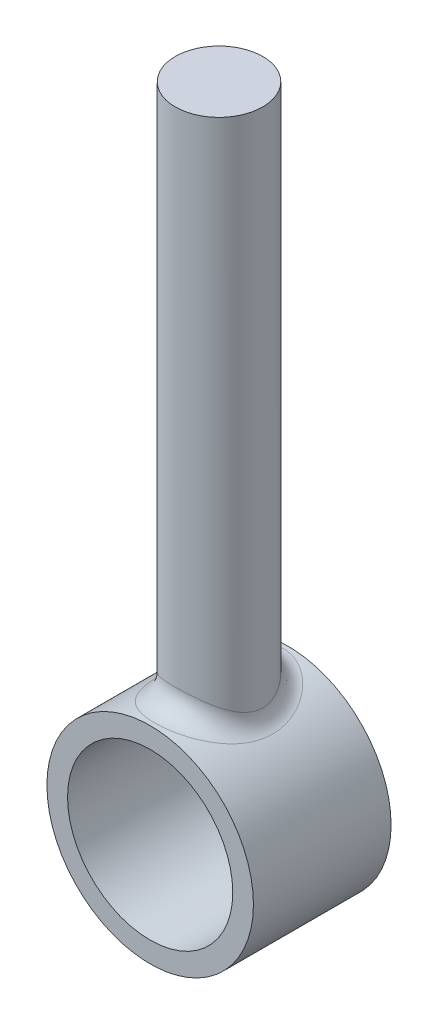
ISO-10303-21;
HEADER;
FILE_DESCRIPTION(('STEP AP214'),'2;1');
FILE_NAME('part.step','',(''),(''),'','','');
FILE_SCHEMA(('AUTOMOTIVE_DESIGN { 1 0 10303 214 1 1 1 1 }'));
ENDSEC;
DATA;
#1=APPLICATION_CONTEXT('core data for automotive mechanical design processes');
#2=APPLICATION_PROTOCOL_DEFINITION('international standard','automotive_design',2000,#1);
#3=PRODUCT_CONTEXT('',#1,'mechanical');
#4=PRODUCT('Part','Part','',(#3));
#5=PRODUCT_RELATED_PRODUCT_CATEGORY('part','',(#4));
#6=PRODUCT_DEFINITION_FORMATION('','',#4);
#7=PRODUCT_DEFINITION_CONTEXT('part definition',#1,'design');
#8=PRODUCT_DEFINITION('design','',#6,#7);
#9=PRODUCT_DEFINITION_SHAPE('','',#8);
#10=(LENGTH_UNIT() NAMED_UNIT(*) SI_UNIT(.MILLI.,.METRE.));
#11=(NAMED_UNIT(*) PLANE_ANGLE_UNIT() SI_UNIT($,.RADIAN.));
#12=(NAMED_UNIT(*) SI_UNIT($,.STERADIAN.) SOLID_ANGLE_UNIT());
#13=UNCERTAINTY_MEASURE_WITH_UNIT(LENGTH_MEASURE(1.E-05),#10,'distance_accuracy_value','');
#14=(GEOMETRIC_REPRESENTATION_CONTEXT(3) GLOBAL_UNCERTAINTY_ASSIGNED_CONTEXT((#13)) GLOBAL_UNIT_ASSIGNED_CONTEXT((#10,
#11,#12)) REPRESENTATION_CONTEXT('',''));
#15=CARTESIAN_POINT('',(0.,0.,0.));
#16=DIRECTION('',(0.,0.,1.));
#17=DIRECTION('',(1.,0.,0.));
#18=AXIS2_PLACEMENT_3D('',#15,#16,#17);
#19=CARTESIAN_POINT('',(0.,-25.978,5.));
#20=DIRECTION('',(0.,0.,-1.));
#21=DIRECTION('',(-1.,0.,0.));
#22=AXIS2_PLACEMENT_3D('',#19,#20,#21);
#23=CYLINDRICAL_SURFACE('',#22,7.5);
#24=CARTESIAN_POINT('',(1.6450289882719,-18.6606316460257,4.23778381515067));
#25=CARTESIAN_POINT('',(1.09322575082646,-18.5365798998911,2.99332384385615));
#26=CARTESIAN_POINT('',(1.34065464070929,-17.1971579752308,2.87806708301677));
#27=CARTESIAN_POINT('',(1.44203939494273,-18.6150002971392,4.35124573353092));
#28=CARTESIAN_POINT('',(0.938295106905664,-18.5179839059775,3.04802916675819));
#29=CARTESIAN_POINT('',(1.17522354966681,-17.1424003564214,2.95512410774215));
#30=CARTESIAN_POINT('',(1.2295609307881,-18.5761689475341,4.44440059404207));
#31=CARTESIAN_POINT('',(0.7877459844616,-18.5051216793896,3.08719460432516));
#32=CARTESIAN_POINT('',(1.002059282641,-17.0958027362642,3.01838970802773));
#33=CARTESIAN_POINT('',(0.792033593211486,-18.5166834757347,4.58540806294734));
#34=CARTESIAN_POINT('',(0.493287508632277,-18.4871656332978,3.14364936201235));
#35=CARTESIAN_POINT('',(0.645486201114157,-17.0244201700815,3.11415413878345));
#36=CARTESIAN_POINT('',(0.566997220877099,-18.4960116077848,4.63330490172375));
#37=CARTESIAN_POINT('',(0.350721627151847,-18.482255314329,3.16039689733207));
#38=CARTESIAN_POINT('',(0.462087574665286,-16.9996139291482,3.14668300806905));
#39=CARTESIAN_POINT('',(0.136977248105188,-18.4764976034986,4.67850004340064));
#40=CARTESIAN_POINT('',(0.0832743171793821,-18.4776035738306,3.1763042660486));
#41=CARTESIAN_POINT('',(0.111632794708939,-16.9761971243712,3.17737703487064));
#42=CARTESIAN_POINT('',(-0.0675626882025528,-18.4755484212161,4.68068241716148));
#43=CARTESIAN_POINT('',(-0.0407890760889766,-18.4774024644325,3.17702748023667));
#44=CARTESIAN_POINT('',(-0.0550617843970073,-16.975058105476,3.17885918171123));
#45=CARTESIAN_POINT('',(-0.473792004223369,-18.4902235916526,4.64672271772461));
#46=CARTESIAN_POINT('',(-0.29244932779864,-18.4808642320687,3.16513524123819));
#47=CARTESIAN_POINT('',(-0.386127815205813,-16.9926683099145,3.15579564249924));
#48=CARTESIAN_POINT('',(-0.675481788317079,-18.5058455688332,4.6105861376942));
#49=CARTESIAN_POINT('',(-0.418970823167175,-18.4844975344669,3.15262163664978));
#50=CARTESIAN_POINT('',(-0.550499596468077,-17.0114146826019,3.13125368710038));
#51=CARTESIAN_POINT('',(-1.06205424216322,-18.5511267345274,4.50397278564577));
#52=CARTESIAN_POINT('',(-0.673728429773465,-18.4973689618262,3.11135220896023));
#53=CARTESIAN_POINT('',(-0.865545810190732,-17.0657520814308,3.05884782768144));
#54=CARTESIAN_POINT('',(-1.24728663322257,-18.5801960144874,4.43493578110697));
#55=CARTESIAN_POINT('',(-0.800736119162803,-18.5062714126281,3.08358695130249));
#56=CARTESIAN_POINT('',(-1.0165052561655,-17.1006352173136,3.01196173366267));
#57=CARTESIAN_POINT('',(-1.60537378751495,-18.6495577382389,4.26588332327446));
#58=CARTESIAN_POINT('',(-1.06009035276438,-18.5315554375819,3.00786961517194));
#59=CARTESIAN_POINT('',(-1.30833671238247,-17.1838692858844,2.89715070616059));
#60=CARTESIAN_POINT('',(-1.77822604949261,-18.6898524419958,4.16586163151495));
#61=CARTESIAN_POINT('',(-1.19176081862819,-18.5477607078329,2.96041043776462));
#62=CARTESIAN_POINT('',(-1.44920668416843,-17.2322229305311,2.82922153585827));
#63=CARTESIAN_POINT('',(-2.12016488755937,-18.7815798706479,3.92972006352564));
#64=CARTESIAN_POINT('',(-1.4653167019894,-18.5899034475254,2.83778700408043));
#65=CARTESIAN_POINT('',(-1.72787769447835,-17.3422958446315,2.6688473158526));
#66=CARTESIAN_POINT('',(-2.28809336781803,-18.8336039437003,3.7915265429772));
#67=CARTESIAN_POINT('',(-1.60704878304232,-18.6162379374504,2.76149912908783));
#68=CARTESIAN_POINT('',(-1.86473491586928,-17.4047247318332,2.57499396224574));
#69=CARTESIAN_POINT('',(-2.60326526228775,-18.9423181027993,3.48651849017231));
#70=CARTESIAN_POINT('',(-1.88422223748493,-18.6771100637053,2.58013710139505));
#71=CARTESIAN_POINT('',(-2.12159158279289,-17.5351817228008,2.36784945579483));
#72=CARTESIAN_POINT('',(-2.75049702919045,-18.9990107879288,3.31968795847309));
#73=CARTESIAN_POINT('',(-2.01971606674273,-18.7114590175672,2.47571588358676));
#74=CARTESIAN_POINT('',(-2.24158153608062,-17.6032129454666,2.25454743701916));
#75=CARTESIAN_POINT('',(-2.96089622763657,-19.0867233986825,3.04124292562409));
#76=CARTESIAN_POINT('',(-2.21983129726087,-18.7684663003568,2.29130982822844));
#77=CARTESIAN_POINT('',(-2.41305125718005,-17.7084680784454,2.06544305645023));
#78=CARTESIAN_POINT('',(-3.03218177524414,-19.117870103987,2.93836081882805));
#79=CARTESIAN_POINT('',(-2.28861167493303,-18.7893137465976,2.22189897392033));
#80=CARTESIAN_POINT('',(-2.47114707247484,-17.7458441246963,1.99557125129197));
#81=CARTESIAN_POINT('',(-3.16722734473644,-19.1791648335793,2.72551155037781));
#82=CARTESIAN_POINT('',(-2.42064584162973,-18.8314802238779,2.07518719612317));
#83=CARTESIAN_POINT('',(-2.58120560077174,-17.8193978001691,1.85101586576116));
#84=CARTESIAN_POINT('',(-3.23099429422513,-19.2093137584953,2.61555105747698));
#85=CARTESIAN_POINT('',(-2.48400536937995,-18.8528071315076,1.99793121365512));
#86=CARTESIAN_POINT('',(-2.63317395958591,-17.8555765101447,1.77633681443499));
#87=CARTESIAN_POINT('',(-3.41057464096305,-19.2970022400912,2.27538963276126));
#88=CARTESIAN_POINT('',(-2.66342847084105,-18.915923011015,1.75580643832311));
#89=CARTESIAN_POINT('',(-2.77952714052119,-17.9608026882087,1.54531809284035));
#90=CARTESIAN_POINT('',(-3.51471086003804,-19.3518023888657,2.03485155503515));
#91=CARTESIAN_POINT('',(-2.77132580212608,-18.9576118044428,1.57817371805187));
#92=CARTESIAN_POINT('',(-2.86439537467316,-18.0265628667302,1.38195800796617));
#93=CARTESIAN_POINT('',(-3.6440120613738,-19.4225766631676,1.6590432167723));
#94=CARTESIAN_POINT('',(-2.90681208166468,-19.0128083300432,1.29362737534344));
#95=CARTESIAN_POINT('',(-2.9697723965578,-18.1114919957557,1.12672988518705));
#96=CARTESIAN_POINT('',(-3.68255802481809,-19.4442190459931,1.53165051688715));
#97=CARTESIAN_POINT('',(-2.94744333162807,-19.0299092268233,1.1964642693053));
#98=CARTESIAN_POINT('',(-3.00118632614852,-18.1374628550801,1.04021184836616));
#99=CARTESIAN_POINT('',(-3.75045670989447,-19.4829555291165,1.27243943600549));
#100=CARTESIAN_POINT('',(-3.01926518005151,-19.0607594730718,0.997295769522146));
#101=CARTESIAN_POINT('',(-3.05652193899948,-18.1839466348634,0.864170098248855));
#102=CARTESIAN_POINT('',(-3.77981522378688,-19.5000524940622,1.14062390168309));
#103=CARTESIAN_POINT('',(-3.050569102651,-19.0745529570825,0.895176407171979));
#104=CARTESIAN_POINT('',(-3.08044834279707,-18.2044629928996,0.774648318255174));
#105=CARTESIAN_POINT('',(-3.82887557518924,-19.5289283477015,0.873766088750262));
#106=CARTESIAN_POINT('',(-3.10296336744375,-19.0979547639757,0.687427271384792));
#107=CARTESIAN_POINT('',(-3.12043121743801,-18.2391140172169,0.593413333001703));
#108=CARTESIAN_POINT('',(-3.84858825686076,-19.5407132072579,0.738727613506815));
#109=CARTESIAN_POINT('',(-3.12415057664282,-19.1076043284358,0.581649843491005));
#110=CARTESIAN_POINT('',(-3.13649652598299,-18.2532558485337,0.50170271077725));
#111=CARTESIAN_POINT('',(-3.8780705755923,-19.5584309062459,0.466548426019344));
#112=CARTESIAN_POINT('',(-3.15583235106425,-19.1221284484046,0.367934018098203));
#113=CARTESIAN_POINT('',(-3.16052382744814,-18.2745170873269,0.316853743873871));
#114=CARTESIAN_POINT('',(-3.88784145392864,-19.5643644762331,0.329407978386319));
#115=CARTESIAN_POINT('',(-3.16638298666518,-19.1270283661936,0.259817888244164));
#116=CARTESIAN_POINT('',(-3.16848683197533,-18.2816373714698,0.223715578904021));
#117=CARTESIAN_POINT('',(-3.89661361086944,-19.5696910413087,0.0732163025680286));
#118=CARTESIAN_POINT('',(-3.17583901086742,-19.1314195708611,0.0578100448446339));
#119=CARTESIAN_POINT('',(-3.17563590532583,-18.2880292495791,0.0497244407815444));
#120=CARTESIAN_POINT('',(-3.89690239622897,-19.5698659714204,-0.0457500390147805));
#121=CARTESIAN_POINT('',(-3.17614941173688,-19.1315634208127,-0.0361334145554285));
#122=CARTESIAN_POINT('',(-3.17587125771396,-18.288239165611,-0.03107088211163));
#123=CARTESIAN_POINT('',(-3.88993898912552,-19.5656386703365,-0.283257256010858));
#124=CARTESIAN_POINT('',(-3.16864618944987,-19.1280797757073,-0.223426369283723));
#125=CARTESIAN_POINT('',(-3.17019626712184,-18.283166404286,-0.192372574937864));
#126=CARTESIAN_POINT('',(-3.88268438258893,-19.5612349738662,-0.401797983030862));
#127=CARTESIAN_POINT('',(-3.16082002712633,-19.1244464593777,-0.316899308097917));
#128=CARTESIAN_POINT('',(-3.16428395673612,-18.2778819685994,-0.272878844090471));
#129=CARTESIAN_POINT('',(-3.84970763571254,-19.5413458315749,-0.755322183868787));
#130=CARTESIAN_POINT('',(-3.12529916671499,-19.1080909620706,-0.595067861358765));
#131=CARTESIAN_POINT('',(-3.13740878971334,-18.2540149979699,-0.512972820060635));
#132=CARTESIAN_POINT('',(-3.81278004710864,-19.5191866309638,-0.988434412664547));
#133=CARTESIAN_POINT('',(-3.0854366920115,-19.0898560741361,-0.777865177617774));
#134=CARTESIAN_POINT('',(-3.10731379239761,-18.2274239571661,-0.671289681328453));
#135=CARTESIAN_POINT('',(-3.71294260883699,-19.4613167861552,-1.43354989137257));
#136=CARTESIAN_POINT('',(-2.97933833937486,-19.0433702151406,-1.12216158329977));
#137=CARTESIAN_POINT('',(-3.02594894966695,-18.1579801433771,-0.973587359381253));
#138=CARTESIAN_POINT('',(-3.65111384807335,-19.4261745011992,-1.64602296691745));
#139=CARTESIAN_POINT('',(-2.91372793442097,-19.015346189868,-1.28490160498296));
#140=CARTESIAN_POINT('',(-2.97556016280449,-18.1158094014768,-1.11788725560658));
#141=CARTESIAN_POINT('',(-3.50374034858941,-19.3461969622425,-2.05615320588233));
#142=CARTESIAN_POINT('',(-2.76031128700814,-18.9535102884862,-1.59315911816067));
#143=CARTESIAN_POINT('',(-2.85545470121372,-18.0198363546532,-1.39642490453017));
#144=CARTESIAN_POINT('',(-3.41817817471035,-19.3013545876657,-2.2537993409276));
#145=CARTESIAN_POINT('',(-2.67193458817433,-18.9195110446618,-1.73898977904403));
#146=CARTESIAN_POINT('',(-2.78572381729725,-17.9660255050384,-1.53065516736964));
#147=CARTESIAN_POINT('',(-3.26780098367605,-19.2270655969954,-2.54833662858927));
#148=CARTESIAN_POINT('',(-2.52085144766769,-18.8655570921606,-1.95010586267325));
#149=CARTESIAN_POINT('',(-2.66317042731189,-17.8768787164846,-1.73068851246341));
#150=CARTESIAN_POINT('',(-3.21031719564777,-19.1994800952031,-2.65143603798126));
#151=CARTESIAN_POINT('',(-2.46343534658038,-18.8458419683228,-2.02310936202533));
#152=CARTESIAN_POINT('',(-2.61632267701609,-17.8437761145134,-1.80070789744967));
#153=CARTESIAN_POINT('',(-3.08895246827081,-19.1433203656377,-2.85148595549195));
#154=CARTESIAN_POINT('',(-2.34392861551065,-18.8066840826799,-2.16237111206372));
#155=CARTESIAN_POINT('',(-2.51741366950535,-17.7763844381579,-1.93657067565185));
#156=CARTESIAN_POINT('',(-3.02507765510105,-19.114747101571,-2.94844220928031));
#157=CARTESIAN_POINT('',(-2.28175813484449,-18.7872312061711,-2.22861394375301));
#158=CARTESIAN_POINT('',(-2.46535740496209,-17.7420965202226,-2.00241797100706));
#159=CARTESIAN_POINT('',(-2.82407228799192,-19.0284789919451,-3.22988207630327));
#160=CARTESIAN_POINT('',(-2.08833137158886,-18.7299255062654,-2.41800599815624));
#161=CARTESIAN_POINT('',(-2.30154340556737,-17.6385747875599,-2.19355627642136));
#162=CARTESIAN_POINT('',(-2.67764301867692,-18.9702780991101,-3.40477636011647));
#163=CARTESIAN_POINT('',(-1.95184856710735,-18.6937660741648,-2.52943750336742));
#164=CARTESIAN_POINT('',(-2.18220746571416,-17.5687337181603,-2.31233474724585));
#165=CARTESIAN_POINT('',(-2.34706369409818,-18.8523358556754,-3.7413037576232));
#166=CARTESIAN_POINT('',(-1.65694948428337,-18.6259005315703,-2.73350264330722));
#167=CARTESIAN_POINT('',(-1.91279415472828,-17.4272030276589,-2.54088543966816));
#168=CARTESIAN_POINT('',(-2.16061196506643,-18.7930152693822,-3.89989624864434));
#169=CARTESIAN_POINT('',(-1.49788805355711,-18.5953116437857,-2.82205656510199));
#170=CARTESIAN_POINT('',(-1.76084098109117,-17.3560183234685,-2.64859263945093));
#171=CARTESIAN_POINT('',(-1.76516469798172,-18.6858206913607,-4.17658944241452));
#172=CARTESIAN_POINT('',(-1.18020218675321,-18.5456165029172,-2.96664203498092));
#173=CARTESIAN_POINT('',(-1.43856203200248,-17.2273848294234,-2.83650726838048));
#174=CARTESIAN_POINT('',(-1.55621896896832,-18.6379221345907,-4.29477728428195));
#175=CARTESIAN_POINT('',(-1.02214758113554,-18.5268474437975,-3.02171178400065));
#176=CARTESIAN_POINT('',(-1.26827684958686,-17.1699065615165,-2.91677387757019));
#177=CARTESIAN_POINT('',(-1.22038847905626,-18.5769675516261,-4.44229861610481));
#178=CARTESIAN_POINT('',(-0.783748454546603,-18.5055890555733,-3.08589760285962));
#179=CARTESIAN_POINT('',(-0.9945839797171,-17.0967610619471,-3.01696216173432));
#180=CARTESIAN_POINT('',(-1.099306909846,-18.5579650179546,-4.48761297986368));
#181=CARTESIAN_POINT('',(-0.70043073848205,-18.4995962247819,-3.10448356232516));
#182=CARTESIAN_POINT('',(-0.89590573829302,-17.07395802147,-3.04773715743192));
#183=CARTESIAN_POINT('',(-0.853306029351656,-18.5256678971008,-4.5640286338107));
#184=CARTESIAN_POINT('',(-0.535806628935572,-18.490030739693,-3.13475856927773));
#185=CARTESIAN_POINT('',(-0.695421598257456,-17.0352014764337,-3.09963441973849));
#186=CARTESIAN_POINT('',(-0.728386594462704,-18.5123734939653,-4.59512946571512));
#187=CARTESIAN_POINT('',(-0.45473775927247,-18.4864904323915,-3.14635138124871));
#188=CARTESIAN_POINT('',(-0.593615598911304,-17.0192481927307,-3.12075637510664));
#189=CARTESIAN_POINT('',(-0.406997469902871,-18.4865015193142,-4.65544519032728));
#190=CARTESIAN_POINT('',(-0.249961386623884,-18.4798305655597,-3.16848575249402));
#191=CARTESIAN_POINT('',(-0.331692055683086,-16.9882018232199,-3.16171946081776));
#192=CARTESIAN_POINT('',(-0.208739266076666,-18.4782874011171,-4.67433802326917));
#193=CARTESIAN_POINT('',(-0.128401729770595,-18.4780648374435,-3.17477437739676));
#194=CARTESIAN_POINT('',(-0.170116920588319,-16.9783448813501,-3.17455042222058));
#195=CARTESIAN_POINT('',(0.187997777898833,-18.4777269348949,-4.67562885641427));
#196=CARTESIAN_POINT('',(0.115663844096953,-18.4779384511558,-3.17521419783692));
#197=CARTESIAN_POINT('',(0.153213162308631,-16.977672321864,-3.17542708430233));
#198=CARTESIAN_POINT('',(0.386476654957567,-18.4853949983396,-4.65799371117943));
#199=CARTESIAN_POINT('',(0.237171879947824,-18.4795818870031,-3.16935084390823));
#200=CARTESIAN_POINT('',(0.314968140191024,-16.9868739980115,-3.16345027444313));
#201=CARTESIAN_POINT('',(0.777351401638813,-18.5158230116388,-4.58711452669661));
#202=CARTESIAN_POINT('',(0.485396432604704,-18.4873403718809,-3.14349593814017));
#203=CARTESIAN_POINT('',(0.633520607537793,-17.0233876139626,-3.11531307427483));
#204=CARTESIAN_POINT('',(0.969758171158538,-18.5385540926135,-4.53393860111182));
#205=CARTESIAN_POINT('',(0.61113591962856,-18.4933839507536,-3.1237352121631));
#206=CARTESIAN_POINT('',(0.790326980126966,-17.0506649111105,-3.07919894297767));
#207=CARTESIAN_POINT('',(1.34386226141183,-18.5969479229879,-4.3943541318289));
#208=CARTESIAN_POINT('',(0.86912872030693,-18.512175410647,-3.06573151106708));
#209=CARTESIAN_POINT('',(1.09521181089972,-17.1207375075619,-2.98440093442744));
#210=CARTESIAN_POINT('',(1.52555840300832,-18.6326120931168,-4.30794193698799));
#211=CARTESIAN_POINT('',(1.00055485443775,-18.5247768533484,-3.02790994587345));
#212=CARTESIAN_POINT('',(1.24328930811812,-17.1635345117404,-2.92571457752125));
#213=CARTESIAN_POINT('',(1.88018388552163,-18.7151383218048,-4.1015696328978));
#214=CARTESIAN_POINT('',(1.27122841260904,-18.5588775393529,-2.927907127394));
#215=CARTESIAN_POINT('',(1.53229959440582,-17.2625659861655,-2.78555798598425));
#216=CARTESIAN_POINT('',(2.05262162503859,-18.7623329545759,-3.98059061831989));
#217=CARTESIAN_POINT('',(1.41009191712221,-18.5804398629805,-2.86556530694843));
#218=CARTESIAN_POINT('',(1.6728317414786,-17.3191995454648,-2.70339576751978));
#219=CARTESIAN_POINT('',(2.37890925178803,-18.8632262240842,-3.70986510006186));
#220=CARTESIAN_POINT('',(1.68522645235529,-18.6322625894902,-2.71394213965717));
#221=CARTESIAN_POINT('',(1.9387474330113,-17.4402714688689,-2.5195340519078));
#222=CARTESIAN_POINT('',(2.53274999875391,-18.9169280332902,-3.5601045433857));
#223=CARTESIAN_POINT('',(1.82134122758631,-18.6623073898989,-2.62532181293161));
#224=CARTESIAN_POINT('',(2.06412352839833,-17.5047136399362,-2.41782501074692));
#225=CARTESIAN_POINT('',(2.83486070963622,-19.0323227111417,-3.21742802207489));
#226=CARTESIAN_POINT('',(2.09752374818,-18.7321644661902,-2.41005703192704));
#227=CARTESIAN_POINT('',(2.3103356799365,-17.6431872533834,-2.18509817542168));
#228=CARTESIAN_POINT('',(2.98075812167023,-19.0942544065299,-3.02160469448358));
#229=CARTESIAN_POINT('',(2.23711779162649,-18.7726156750326,-2.28075781997533));
#230=CARTESIAN_POINT('',(2.42923816974049,-17.7175052878528,-2.05210586202949));
#231=CARTESIAN_POINT('',(3.24388575203309,-19.2142619908608,-2.60227160095058));
#232=CARTESIAN_POINT('',(2.49483197361197,-18.8554453921601,-1.99098423215386));
#233=CARTESIAN_POINT('',(2.64368015299956,-17.8615143890161,-1.76731814609959));
#234=CARTESIAN_POINT('',(3.3610981809358,-19.2723354708928,-2.37874478304632));
#235=CARTESIAN_POINT('',(2.61371752006957,-18.8978930107188,-1.83075759576683));
#236=CARTESIAN_POINT('',(2.739205148548,-17.9312025650172,-1.61551116281725));
#237=CARTESIAN_POINT('',(3.56664689338009,-19.3792905557738,-1.90047163430607));
#238=CARTESIAN_POINT('',(2.82465149853307,-18.9784501110869,-1.47817968466051));
#239=CARTESIAN_POINT('',(2.90672185319329,-18.0595486669843,-1.29069463934187));
#240=CARTESIAN_POINT('',(3.65396592590354,-19.4278280582718,-1.64496778808642));
#241=CARTESIAN_POINT('',(2.91682503879126,-19.0166884445356,-1.28456345795185));
#242=CARTESIAN_POINT('',(2.97788452990732,-18.1177936701348,-1.11717063682946));
#243=CARTESIAN_POINT('',(3.75613392041929,-19.4862386867531,-1.24841849045485));
#244=CARTESIAN_POINT('',(3.02529885849065,-19.0633898013392,-0.978777011364158));
#245=CARTESIAN_POINT('',(3.06114871379366,-18.1878864239994,-0.847856407955606));
#246=CARTESIAN_POINT('',(3.78538745486613,-19.5033091568464,-1.1140264954295));
#247=CARTESIAN_POINT('',(3.05650966811333,-19.077181505314,-0.874552188657725));
#248=CARTESIAN_POINT('',(3.08498956226282,-18.2083709879166,-0.756584839140963));
#249=CARTESIAN_POINT('',(3.8338948893682,-19.5319115887295,-0.841865295881928));
#250=CARTESIAN_POINT('',(3.10833976648013,-19.1003870870809,-0.662496541198385));
#251=CARTESIAN_POINT('',(3.12452182437553,-18.242693906217,-0.571748088646151));
#252=CARTESIAN_POINT('',(3.85315526044696,-19.5434471342673,-0.704098337486703));
#253=CARTESIAN_POINT('',(3.12905378723532,-19.1098416112158,-0.5545058986134));
#254=CARTESIAN_POINT('',(3.14021851173034,-18.2565365610974,-0.478184432410519));
#255=CARTESIAN_POINT('',(3.87963049004674,-19.5593808894495,-0.443323681963455));
#256=CARTESIAN_POINT('',(3.15752186210686,-19.122915462661,-0.349604235725987));
#257=CARTESIAN_POINT('',(3.16179511594568,-18.27565706736,-0.301080789355068));
#258=CARTESIAN_POINT('',(3.88802036140002,-19.564473528746,-0.320545895275256));
#259=CARTESIAN_POINT('',(3.16657657482318,-19.1271186492627,-0.25282144669688));
#260=CARTESIAN_POINT('',(3.16863263682809,-18.2817682343728,-0.217696944919618));
#261=CARTESIAN_POINT('',(3.89669040224774,-19.5697372698367,-0.0744487756341374));
#262=CARTESIAN_POINT('',(3.17592116168476,-19.1314573533074,-0.0587864889222732));
#263=CARTESIAN_POINT('',(3.17569848830243,-18.2880847236732,-0.0505614679439729));
#264=CARTESIAN_POINT('',(3.8969725170058,-19.5699095521535,0.0488704203187591));
#265=CARTESIAN_POINT('',(3.17622643732836,-19.1316000198298,0.038603038577304));
#266=CARTESIAN_POINT('',(3.17592840423224,-18.2882914625881,0.0331900715534273));
#267=CARTESIAN_POINT('',(3.88942309082239,-19.5653243460202,0.294993729688173));
#268=CARTESIAN_POINT('',(3.16808823409254,-19.127819777587,0.232679239890809));
#269=CARTESIAN_POINT('',(3.16977582375181,-18.2827892152204,0.200343335135773));
#270=CARTESIAN_POINT('',(3.88159329868162,-19.5605679201228,0.417797948396279));
#271=CARTESIAN_POINT('',(3.15963504377317,-19.1238923570291,0.329503901107549));
#272=CARTESIAN_POINT('',(3.16339475256736,-18.2770815040011,0.283745130728909));
#273=CARTESIAN_POINT('',(3.8579486265654,-19.5463274114653,0.661908838664071));
#274=CARTESIAN_POINT('',(3.13421149442978,-19.1122051936605,0.521359548785477));
#275=CARTESIAN_POINT('',(3.14412497701384,-18.2599928935863,0.449531671178193));
#276=CARTESIAN_POINT('',(3.84213090923723,-19.5368416488354,0.783214962396519));
#277=CARTESIAN_POINT('',(3.11720276429753,-19.1044280136192,0.616519395462786));
#278=CARTESIAN_POINT('',(3.13123396027812,-18.248609978547,0.531916043980549));
#279=CARTESIAN_POINT('',(3.7862351419192,-19.503723594446,1.12372724570149));
#280=CARTESIAN_POINT('',(3.05729500361842,-19.0774484076798,0.882680209631108));
#281=CARTESIAN_POINT('',(3.08568040438867,-18.2088683134371,0.763173049219685));
#282=CARTESIAN_POINT('',(3.73692775095544,-19.47489229109,1.34012518870466));
#283=CARTESIAN_POINT('',(3.00451259378932,-19.0540766476848,1.05052668174475));
#284=CARTESIAN_POINT('',(3.04549619917216,-18.1742707493065,0.910138497141138));
#285=CARTESIAN_POINT('',(3.61400004099658,-19.4057927795822,1.75994890929246));
#286=CARTESIAN_POINT('',(2.87509188219504,-18.9995283484021,1.37104774675635));
#287=CARTESIAN_POINT('',(2.9453134023973,-18.0913513355002,1.19525941968044));
#288=CARTESIAN_POINT('',(3.54036279347277,-19.3655166109188,1.9633655366611));
#289=CARTESIAN_POINT('',(2.79793141969463,-18.9681574025135,1.52416824475721));
#290=CARTESIAN_POINT('',(2.88530101454064,-18.043019933211,1.33340867998046));
#291=CARTESIAN_POINT('',(3.409237924274,-19.2974435720037,2.26566700226669));
#292=CARTESIAN_POINT('',(2.66386805428019,-18.9171000061972,1.74610464090418));
#293=CARTESIAN_POINT('',(2.77843775220714,-17.9613322863449,1.53871502292865));
#294=CARTESIAN_POINT('',(3.35944378685304,-19.2722103126565,2.37032198350185));
#295=CARTESIAN_POINT('',(2.61316305761291,-18.8984004600661,1.82222742307494));
#296=CARTESIAN_POINT('',(2.73785686164165,-17.9310523750039,1.60979086579736));
#297=CARTESIAN_POINT('',(3.2535714791029,-19.2202081026348,2.57421661024352));
#298=CARTESIAN_POINT('',(2.50664038344969,-18.860648649693,1.96845203060913));
#299=CARTESIAN_POINT('',(2.65157376166292,-17.8686497228783,1.74826475668319));
#300=CARTESIAN_POINT('',(3.19749950601042,-19.1934406789517,2.67346145497089));
#301=CARTESIAN_POINT('',(2.45074232944054,-18.8415792837514,2.03856246678061));
#302=CARTESIAN_POINT('',(2.60587660283191,-17.8365288144834,1.81566633572197));
#303=CARTESIAN_POINT('',(3.02013662540333,-19.1117272610509,2.96283900760557));
#304=CARTESIAN_POINT('',(2.27554850796895,-18.7845206471147,2.24050179347053));
#305=CARTESIAN_POINT('',(2.46133059742113,-17.7384727131309,2.0121954757499));
#306=CARTESIAN_POINT('',(2.88973990756671,-19.0553923535227,3.14452039478219));
#307=CARTESIAN_POINT('',(2.14999512298036,-18.7471904540439,2.3618162720396));
#308=CARTESIAN_POINT('',(2.35506075889447,-17.6708708242548,2.13558336972411));
#309=CARTESIAN_POINT('',(2.58973736886008,-18.9372387459842,3.50287311731426));
#310=CARTESIAN_POINT('',(1.87179357294615,-18.6738233181564,2.59124357846128));
#311=CARTESIAN_POINT('',(2.11056671130569,-17.5290864951501,2.37895660907866));
#312=CARTESIAN_POINT('',(2.41728448306893,-18.8755944787389,3.67619947495837));
#313=CARTESIAN_POINT('',(1.71767875422384,-18.6387421384968,2.69491071486171));
#314=CARTESIAN_POINT('',(1.97002222046602,-17.4551133741911,2.49667023162438));
#315=CARTESIAN_POINT('',(2.04816929152852,-18.7604990064852,3.98594777839565));
#316=CARTESIAN_POINT('',(1.40544293067487,-18.5792205642925,2.86920129078848));
#317=CARTESIAN_POINT('',(1.66920320875533,-17.3169988075763,2.70703405270753));
#318=CARTESIAN_POINT('',(1.8515080968682,-18.7070474257098,4.12237141699493));
#319=CARTESIAN_POINT('',(1.24753026018411,-18.555100740212,2.93883960629004));
#320=CARTESIAN_POINT('',(1.50892959339208,-17.2528569109999,2.79968540090472));
#321=CARTESIAN_POINT('',(1.6450289882719,-18.6606316460257,4.23778381515067));
#322=CARTESIAN_POINT('',(1.09322575082646,-18.5365798998911,2.99332384385615));
#323=CARTESIAN_POINT('',(1.34065464070929,-17.1971579752308,2.87806708301677));
#324=(BOUNDED_SURFACE() B_SPLINE_SURFACE(3,2,((#24,#25,#26),(#27,#28,#29),(#30,#31,#32),(#33,
#34,#35),(#36,#37,#38),(#39,#40,#41),(#42,#43,#44),(#45,#46,#47),(#48,#49,#50),(#51,#52,#53),
(#54,#55,#56),(#57,#58,#59),(#60,#61,#62),(#63,#64,#65),(#66,#67,#68),(#69,#70,#71),(#72,#73,
#74),(#75,#76,#77),(#78,#79,#80),(#81,#82,#83),(#84,#85,#86),(#87,#88,#89),(#90,#91,#92),(#93,
#94,#95),(#96,#97,#98),(#99,#100,#101),(#102,#103,#104),(#105,#106,#107),(#108,#109,#110),(#111,
#112,#113),(#114,#115,#116),(#117,#118,#119),(#120,#121,#122),(#123,#124,#125),(#126,#127,#128),
(#129,#130,#131),(#132,#133,#134),(#135,#136,#137),(#138,#139,#140),(#141,#142,#143),(#144,#145,
#146),(#147,#148,#149),(#150,#151,#152),(#153,#154,#155),(#156,#157,#158),(#159,#160,#161),
(#162,#163,#164),(#165,#166,#167),(#168,#169,#170),(#171,#172,#173),(#174,#175,#176),(#177,#178,
#179),(#180,#181,#182),(#183,#184,#185),(#186,#187,#188),(#189,#190,#191),(#192,#193,#194),
(#195,#196,#197),(#198,#199,#200),(#201,#202,#203),(#204,#205,#206),(#207,#208,#209),(#210,#211,
#212),(#213,#214,#215),(#216,#217,#218),(#219,#220,#221),(#222,#223,#224),(#225,#226,#227),
(#228,#229,#230),(#231,#232,#233),(#234,#235,#236),(#237,#238,#239),(#240,#241,#242),(#243,#244,
#245),(#246,#247,#248),(#249,#250,#251),(#252,#253,#254),(#255,#256,#257),(#258,#259,#260),
(#261,#262,#263),(#264,#265,#266),(#267,#268,#269),(#270,#271,#272),(#273,#274,#275),(#276,#277,
#278),(#279,#280,#281),(#282,#283,#284),(#285,#286,#287),(#288,#289,#290),(#291,#292,#293),
(#294,#295,#296),(#297,#298,#299),(#300,#301,#302),(#303,#304,#305),(#306,#307,#308),(#309,#310,
#311),(#312,#313,#314),(#315,#316,#317),(#318,#319,#320),(#321,#322,#323)),.UNSPECIFIED.,.T.,
.F.,.F.) B_SPLINE_SURFACE_WITH_KNOTS((4,2,2,2,2,2,2,2,2,2,2,2,2,2,2,2,2,2,2,2,2,2,2,2,2,2,2,2,2,
2,2,2,2,2,2,2,2,2,2,2,2,2,2,2,2,2,2,2,2,4),(3,3),(0.,0.821606259216099,1.64240873474933,
2.37501086761425,3.10750799338202,3.81054116089961,4.51371596941708,5.26729564567649,
6.02129772400954,6.43762191734965,6.85355946304271,7.68519572483423,8.0987077542025,
8.5119585557655,8.92474369363518,9.33747728720308,9.69389771281078,10.0504322369632,
10.7628299520495,11.4471576460655,12.1319894018531,12.51681565616,12.9012765026062,
13.6707771904553,14.5166771933839,15.3607411951722,15.8216643327915,16.2826023308045,
16.9954782658921,17.7090013470075,18.4211608722236,19.1333986534885,19.8692919889672,
20.6055455518867,21.4208676697921,22.2366941479419,23.0780243573927,23.498649546644,
23.9190020211253,24.2885204790434,24.6579502790436,25.0273004523057,25.3967819130541,
26.0746994902925,26.7530897542524,27.125538482197,27.4976227320308,28.2421171907078,
29.0778857090332,29.9136158823774),(0.,1.),
.UNSPECIFIED.) GEOMETRIC_REPRESENTATION_ITEM() RATIONAL_B_SPLINE_SURFACE(((1.,0.739126472397664,
1.),(1.,0.73139689512598,1.),(1.,0.724619909387823,1.),(1.,0.714107061166855,1.),(1.,
0.710368230016079,1.),(1.,0.70683701564119,1.),(1.,0.706663733679413,1.),(1.,0.709321793902146,
1.),(1.,0.712152705424174,1.),(1.,0.720209580851779,1.),(1.,0.725334625861839,1.),(1.,
0.737284350767784,1.),(1.,0.744109372883275,1.),(1.,0.759240580641028,1.),(1.,0.76761786989597,
1.),(1.,0.784612275723696,1.),(1.,0.793229524094201,1.),(1.,0.806193385242434,1.),(1.,
0.810724252815197,1.),(1.,0.819512360976109,1.),(1.,0.823769851778532,1.),(1.,0.83598463295381,
1.),(1.,0.843386995548311,1.),(1.,0.852766155319484,1.),(1.,0.855599606039857,1.),(1.,
0.860631599162769,1.),(1.,0.862830541524932,1.),(1.,0.866524322792628,1.),(1.,0.868019952311456,
1.),(1.,0.870262471046317,1.),(1.,0.871009453733907,1.),(1.,0.871680041500495,1.),(1.,
0.871702082179578,1.),(1.,0.871169842470237,1.),(1.,0.87061537758565,1.),(1.,0.868102554376981,
1.),(1.,0.865295324862801,1.),(1.,0.857835744182307,1.),(1.,0.853260453138911,1.),(1.,
0.84262037486477,1.),(1.,0.836554492983944,1.),(1.,0.826255435138652,1.),(1.,0.822383487103352,
1.),(1.,0.814390688971354,1.),(1.,0.810270078708129,1.),(1.,0.797646427478733,1.),(1.,
0.78888738672502,1.),(1.,0.770613259710145,1.),(1.,0.761109451096874,1.),(1.,0.743460250613596,
1.),(1.,0.735311955111799,1.),(1.,0.724747200786165,1.),(1.,0.721407855468871,1.),(1.,
0.715687832990762,1.),(1.,0.713307186741362,1.),(1.,0.708656854087813,1.),(1.,0.707159024312989,
1.),(1.,0.707057140018874,1.),(1.,0.708455713691965,1.),(1.,0.713929092851363,1.),(1.,
0.717998778901243,1.),(1.,0.728237506156992,1.),(1.,0.734406778002539,1.),(1.,0.748322578183258,
1.),(1.,0.756114686594948,1.),(1.,0.7723025695772,1.),(1.,0.780698637781476,1.),(1.,
0.798232422176694,1.),(1.,0.807352952052359,1.),(1.,0.824528302779772,1.),(1.,0.832582460891182,
1.),(1.,0.847084646085993,1.),(1.,0.853474592515465,1.),(1.,0.861055702864218,1.),(1.,
0.863248714904107,1.),(1.,0.866903952269202,1.),(1.,0.868366650482328,1.),(1.,0.870381917652164,
1.),(1.,0.871023158994274,1.),(1.,0.871685884252601,1.),(1.,0.87170751682922,1.),(1.,
0.871130326648012,1.),(1.,0.870531637621853,1.),(1.,0.868731267135461,1.),(1.,0.867529371413999,
1.),(1.,0.863307028662498,1.),(1.,0.859606041791972,1.),(1.,0.850564300496365,1.),(1.,
0.845222404521664,1.),(1.,0.835983630010148,1.),(1.,0.832521533570239,1.),(1.,0.825294675276262,
1.),(1.,0.821530212925894,1.),(1.,0.809879851542328,1.),(1.,0.801639966146108,1.),(1.,
0.7838527016287,1.),(1.,0.774268874596425,1.),(1.,0.755837003566023,1.),(1.,0.746988925830413,
1.),(1.,0.739126472397664,1.))) REPRESENTATION_ITEM('') SURFACE());
#325=CARTESIAN_POINT('',(1.6450289882719,-18.6606316460257,4.23778381515067));
#326=CARTESIAN_POINT('',(1.44203939494273,-18.6150002971392,4.35124573353092));
#327=CARTESIAN_POINT('',(1.2295609307881,-18.5761689475341,4.44440059404207));
#328=CARTESIAN_POINT('',(0.792033593211486,-18.5166834757347,4.58540806294734));
#329=CARTESIAN_POINT('',(0.566997220877099,-18.4960116077848,4.63330490172375));
#330=CARTESIAN_POINT('',(0.136977248105188,-18.4764976034986,4.67850004340064));
#331=CARTESIAN_POINT('',(-0.0675626882025527,-18.4755484212161,4.68068241716148));
#332=CARTESIAN_POINT('',(-0.473792004223369,-18.4902235916526,4.64672271772461));
#333=CARTESIAN_POINT('',(-0.675481788317079,-18.5058455688332,4.6105861376942));
#334=CARTESIAN_POINT('',(-1.06205424216322,-18.5511267345274,4.50397278564577));
#335=CARTESIAN_POINT('',(-1.24728663322257,-18.5801960144874,4.43493578110697));
#336=CARTESIAN_POINT('',(-1.60537378751495,-18.6495577382389,4.26588332327446));
#337=CARTESIAN_POINT('',(-1.77822604949261,-18.6898524419958,4.16586163151495));
#338=CARTESIAN_POINT('',(-2.12016488755937,-18.7815798706479,3.92972006352564));
#339=CARTESIAN_POINT('',(-2.28809336781803,-18.8336039437003,3.7915265429772));
#340=CARTESIAN_POINT('',(-2.60326526228775,-18.9423181027993,3.48651849017231));
#341=CARTESIAN_POINT('',(-2.75049702919045,-18.9990107879288,3.31968795847309));
#342=CARTESIAN_POINT('',(-2.96089622763657,-19.0867233986825,3.04124292562409));
#343=CARTESIAN_POINT('',(-3.03218177524414,-19.117870103987,2.93836081882805));
#344=CARTESIAN_POINT('',(-3.16722734473644,-19.1791648335793,2.72551155037781));
#345=CARTESIAN_POINT('',(-3.23099429422513,-19.2093137584953,2.61555105747698));
#346=CARTESIAN_POINT('',(-3.41057464096305,-19.2970022400912,2.27538963276126));
#347=CARTESIAN_POINT('',(-3.51471086003804,-19.3518023888657,2.03485155503515));
#348=CARTESIAN_POINT('',(-3.64401206137381,-19.4225766631676,1.6590432167723));
#349=CARTESIAN_POINT('',(-3.68255802481809,-19.4442190459931,1.53165051688715));
#350=CARTESIAN_POINT('',(-3.75045670989447,-19.4829555291165,1.27243943600549));
#351=CARTESIAN_POINT('',(-3.77981522378688,-19.5000524940622,1.14062390168309));
#352=CARTESIAN_POINT('',(-3.82887557518924,-19.5289283477015,0.873766088750262));
#353=CARTESIAN_POINT('',(-3.84858825686076,-19.5407132072579,0.738727613506815));
#354=CARTESIAN_POINT('',(-3.8780705755923,-19.5584309062459,0.466548426019344));
#355=CARTESIAN_POINT('',(-3.88784145392864,-19.5643644762331,0.329407978386319));
#356=CARTESIAN_POINT('',(-3.89661361086944,-19.5696910413087,0.0732163025680286));
#357=CARTESIAN_POINT('',(-3.89690239622897,-19.5698659714204,-0.0457500390147807));
#358=CARTESIAN_POINT('',(-3.88993898912552,-19.5656386703365,-0.283257256010858));
#359=CARTESIAN_POINT('',(-3.88268438258893,-19.5612349738662,-0.401797983030862));
#360=CARTESIAN_POINT('',(-3.84970763571254,-19.5413458315749,-0.755322183868786));
#361=CARTESIAN_POINT('',(-3.81278004710864,-19.5191866309638,-0.988434412664546));
#362=CARTESIAN_POINT('',(-3.71294260883699,-19.4613167861552,-1.43354989137257));
#363=CARTESIAN_POINT('',(-3.65111384807335,-19.4261745011992,-1.64602296691745));
#364=CARTESIAN_POINT('',(-3.50374034858941,-19.3461969622425,-2.05615320588233));
#365=CARTESIAN_POINT('',(-3.41817817471035,-19.3013545876657,-2.2537993409276));
#366=CARTESIAN_POINT('',(-3.26780098367605,-19.2270655969954,-2.54833662858927));
#367=CARTESIAN_POINT('',(-3.21031719564777,-19.1994800952031,-2.65143603798125));
#368=CARTESIAN_POINT('',(-3.08895246827081,-19.1433203656377,-2.85148595549195));
#369=CARTESIAN_POINT('',(-3.02507765510105,-19.114747101571,-2.94844220928031));
#370=CARTESIAN_POINT('',(-2.82407228799192,-19.0284789919451,-3.22988207630327));
#371=CARTESIAN_POINT('',(-2.67764301867692,-18.9702780991101,-3.40477636011647));
#372=CARTESIAN_POINT('',(-2.34706369409818,-18.8523358556754,-3.7413037576232));
#373=CARTESIAN_POINT('',(-2.16061196506643,-18.7930152693822,-3.89989624864434));
#374=CARTESIAN_POINT('',(-1.76516469798172,-18.6858206913607,-4.17658944241452));
#375=CARTESIAN_POINT('',(-1.55621896896832,-18.6379221345907,-4.29477728428194));
#376=CARTESIAN_POINT('',(-1.22038847905626,-18.5769675516261,-4.44229861610481));
#377=CARTESIAN_POINT('',(-1.099306909846,-18.5579650179546,-4.48761297986368));
#378=CARTESIAN_POINT('',(-0.853306029351656,-18.5256678971008,-4.5640286338107));
#379=CARTESIAN_POINT('',(-0.728386594462704,-18.5123734939653,-4.59512946571512));
#380=CARTESIAN_POINT('',(-0.406997469902871,-18.4865015193142,-4.65544519032728));
#381=CARTESIAN_POINT('',(-0.208739266076667,-18.4782874011171,-4.67433802326917));
#382=CARTESIAN_POINT('',(0.187997777898833,-18.4777269348949,-4.67562885641427));
#383=CARTESIAN_POINT('',(0.386476654957567,-18.4853949983396,-4.65799371117943));
#384=CARTESIAN_POINT('',(0.777351401638813,-18.5158230116388,-4.58711452669661));
#385=CARTESIAN_POINT('',(0.969758171158539,-18.5385540926135,-4.53393860111182));
#386=CARTESIAN_POINT('',(1.34386226141182,-18.5969479229879,-4.3943541318289));
#387=CARTESIAN_POINT('',(1.52555840300832,-18.6326120931168,-4.30794193698799));
#388=CARTESIAN_POINT('',(1.88018388552163,-18.7151383218048,-4.10156963289779));
#389=CARTESIAN_POINT('',(2.05262162503859,-18.7623329545759,-3.98059061831988));
#390=CARTESIAN_POINT('',(2.37890925178803,-18.8632262240842,-3.70986510006186));
#391=CARTESIAN_POINT('',(2.53274999875391,-18.9169280332902,-3.5601045433857));
#392=CARTESIAN_POINT('',(2.83486070963622,-19.0323227111417,-3.21742802207489));
#393=CARTESIAN_POINT('',(2.98075812167024,-19.0942544065299,-3.02160469448358));
#394=CARTESIAN_POINT('',(3.2438857520331,-19.2142619908608,-2.60227160095058));
#395=CARTESIAN_POINT('',(3.3610981809358,-19.2723354708928,-2.37874478304632));
#396=CARTESIAN_POINT('',(3.56664689338009,-19.3792905557738,-1.90047163430607));
#397=CARTESIAN_POINT('',(3.65396592590355,-19.4278280582718,-1.64496778808642));
#398=CARTESIAN_POINT('',(3.75613392041929,-19.4862386867531,-1.24841849045485));
#399=CARTESIAN_POINT('',(3.78538745486613,-19.5033091568464,-1.1140264954295));
#400=CARTESIAN_POINT('',(3.8338948893682,-19.5319115887295,-0.841865295881928));
#401=CARTESIAN_POINT('',(3.85315526044696,-19.5434471342673,-0.704098337486703));
#402=CARTESIAN_POINT('',(3.87963049004674,-19.5593808894495,-0.443323681963455));
#403=CARTESIAN_POINT('',(3.88802036140002,-19.564473528746,-0.320545895275256));
#404=CARTESIAN_POINT('',(3.89669040224774,-19.5697372698367,-0.0744487756341373));
#405=CARTESIAN_POINT('',(3.8969725170058,-19.5699095521535,0.0488704203187588));
#406=CARTESIAN_POINT('',(3.88942309082239,-19.5653243460202,0.294993729688173));
#407=CARTESIAN_POINT('',(3.88159329868162,-19.5605679201228,0.417797948396279));
#408=CARTESIAN_POINT('',(3.8579486265654,-19.5463274114653,0.661908838664071));
#409=CARTESIAN_POINT('',(3.84213090923723,-19.5368416488354,0.78321496239652));
#410=CARTESIAN_POINT('',(3.7862351419192,-19.503723594446,1.12372724570149));
#411=CARTESIAN_POINT('',(3.73692775095544,-19.47489229109,1.34012518870466));
#412=CARTESIAN_POINT('',(3.61400004099658,-19.4057927795822,1.75994890929246));
#413=CARTESIAN_POINT('',(3.54036279347277,-19.3655166109188,1.9633655366611));
#414=CARTESIAN_POINT('',(3.409237924274,-19.2974435720037,2.26566700226669));
#415=CARTESIAN_POINT('',(3.35944378685304,-19.2722103126565,2.37032198350185));
#416=CARTESIAN_POINT('',(3.2535714791029,-19.2202081026348,2.57421661024352));
#417=CARTESIAN_POINT('',(3.19749950601042,-19.1934406789517,2.67346145497089));
#418=CARTESIAN_POINT('',(3.02013662540334,-19.1117272610509,2.96283900760557));
#419=CARTESIAN_POINT('',(2.88973990756671,-19.0553923535227,3.14452039478219));
#420=CARTESIAN_POINT('',(2.58973736886008,-18.9372387459842,3.50287311731426));
#421=CARTESIAN_POINT('',(2.41728448306893,-18.8755944787389,3.67619947495837));
#422=CARTESIAN_POINT('',(2.04816929152852,-18.7604990064852,3.98594777839565));
#423=CARTESIAN_POINT('',(1.8515080968682,-18.7070474257098,4.12237141699493));
#424=CARTESIAN_POINT('',(1.6450289882719,-18.6606316460257,4.23778381515067));
#425=B_SPLINE_CURVE_WITH_KNOTS('',3,(#325,#326,#327,#328,#329,#330,#331,#332,#333,#334,#335,
#336,#337,#338,#339,#340,#341,#342,#343,#344,#345,#346,#347,#348,#349,#350,#351,#352,#353,#354,
#355,#356,#357,#358,#359,#360,#361,#362,#363,#364,#365,#366,#367,#368,#369,#370,#371,#372,#373,
#374,#375,#376,#377,#378,#379,#380,#381,#382,#383,#384,#385,#386,#387,#388,#389,#390,#391,#392,
#393,#394,#395,#396,#397,#398,#399,#400,#401,#402,#403,#404,#405,#406,#407,#408,#409,#410,#411,
#412,#413,#414,#415,#416,#417,#418,#419,#420,#421,#422,#423,#424),.UNSPECIFIED.,.T.,.F.,(4,2,2,
2,2,2,2,2,2,2,2,2,2,2,2,2,2,2,2,2,2,2,2,2,2,2,2,2,2,2,2,2,2,2,2,2,2,2,2,2,2,2,2,2,2,2,2,2,2,4),
(0.,0.821606259216099,1.64240873474933,2.37501086761425,3.10750799338202,3.81054116089961,
4.51371596941708,5.26729564567649,6.02129772400954,6.43762191734965,6.85355946304271,
7.68519572483423,8.0987077542025,8.5119585557655,8.92474369363518,9.33747728720308,
9.69389771281078,10.0504322369632,10.7628299520495,11.4471576460655,12.1319894018531,
12.51681565616,12.9012765026062,13.6707771904553,14.5166771933839,15.3607411951722,
15.8216643327915,16.2826023308045,16.9954782658921,17.7090013470075,18.4211608722236,
19.1333986534885,19.8692919889672,20.6055455518867,21.4208676697921,22.2366941479419,
23.0780243573927,23.498649546644,23.9190020211253,24.2885204790434,24.6579502790436,
25.0273004523057,25.3967819130541,26.0746994902925,26.7530897542524,27.125538482197,
27.4976227320308,28.2421171907078,29.0778857090332,29.9136158823774),.UNSPECIFIED.);
#426=CARTESIAN_POINT('',(1.6450289882719,-18.6606316460257,4.23778381515067));
#427=VERTEX_POINT('',#426);
#428=EDGE_CURVE('E10',#427,#427,#425,.T.);
#429=ORIENTED_EDGE('',*,*,#428,.T.);
#430=EDGE_LOOP('',(#429));
#431=FACE_BOUND('',#430,.T.);
#432=CARTESIAN_POINT('',(0.,-25.978,5.));
#433=DIRECTION('',(0.,0.,-1.));
#434=DIRECTION('',(-1.,0.,0.));
#435=AXIS2_PLACEMENT_3D('',#432,#433,#434);
#436=CIRCLE('',#435,7.5);
#437=CARTESIAN_POINT('',(-7.5,-25.978,5.));
#438=VERTEX_POINT('',#437);
#439=EDGE_CURVE('E48',#438,#438,#436,.T.);
#440=ORIENTED_EDGE('',*,*,#439,.T.);
#441=EDGE_LOOP('',(#440));
#442=FACE_BOUND('',#441,.T.);
#443=CARTESIAN_POINT('',(0.,-25.978,-5.));
#444=DIRECTION('',(0.,0.,-1.));
#445=DIRECTION('',(-1.,0.,0.));
#446=AXIS2_PLACEMENT_3D('',#443,#444,#445);
#447=CIRCLE('',#446,7.5);
#448=CARTESIAN_POINT('',(-7.5,-25.978,-5.));
#449=VERTEX_POINT('',#448);
#450=EDGE_CURVE('E99',#449,#449,#447,.T.);
#451=ORIENTED_EDGE('',*,*,#450,.F.);
#452=EDGE_LOOP('',(#451));
#453=FACE_BOUND('',#452,.T.);
#454=ADVANCED_FACE('F34',(#431,#442,#453),#23,.T.);
#455=CARTESIAN_POINT('',(0.,-25.978,5.));
#456=DIRECTION('',(0.,0.,-1.));
#457=DIRECTION('',(-1.,0.,0.));
#458=AXIS2_PLACEMENT_3D('',#455,#456,#457);
#459=PLANE('',#458);
#460=CARTESIAN_POINT('',(0.,-25.978,5.));
#461=DIRECTION('',(0.,0.,1.));
#462=DIRECTION('',(1.,0.,0.));
#463=AXIS2_PLACEMENT_3D('',#460,#461,#462);
#464=CIRCLE('',#463,6.);
#465=CARTESIAN_POINT('',(6.,-25.978,5.));
#466=VERTEX_POINT('',#465);
#467=EDGE_CURVE('E95',#466,#466,#464,.T.);
#468=ORIENTED_EDGE('',*,*,#467,.F.);
#469=EDGE_LOOP('',(#468));
#470=FACE_BOUND('',#469,.T.);
#471=ORIENTED_EDGE('',*,*,#439,.F.);
#472=EDGE_LOOP('',(#471));
#473=FACE_BOUND('',#472,.T.);
#474=ADVANCED_FACE('F64',(#470,#473),#459,.F.);
#475=CARTESIAN_POINT('',(0.,-25.978,-5.));
#476=DIRECTION('',(0.,0.,-1.));
#477=DIRECTION('',(-1.,0.,0.));
#478=AXIS2_PLACEMENT_3D('',#475,#476,#477);
#479=PLANE('',#478);
#480=CARTESIAN_POINT('',(0.,-25.978,-5.));
#481=DIRECTION('',(0.,0.,1.));
#482=DIRECTION('',(1.,0.,0.));
#483=AXIS2_PLACEMENT_3D('',#480,#481,#482);
#484=CIRCLE('',#483,6.);
#485=CARTESIAN_POINT('',(6.,-25.978,-5.));
#486=VERTEX_POINT('',#485);
#487=EDGE_CURVE('E103',#486,#486,#484,.T.);
#488=ORIENTED_EDGE('',*,*,#487,.T.);
#489=EDGE_LOOP('',(#488));
#490=FACE_BOUND('',#489,.T.);
#491=ORIENTED_EDGE('',*,*,#450,.T.);
#492=EDGE_LOOP('',(#491));
#493=FACE_BOUND('',#492,.T.);
#494=ADVANCED_FACE('F65',(#490,#493),#479,.T.);
#495=CARTESIAN_POINT('',(0.,-25.978,5.));
#496=DIRECTION('',(0.,0.,-1.));
#497=DIRECTION('',(-1.,0.,0.));
#498=AXIS2_PLACEMENT_3D('',#495,#496,#497);
#499=CYLINDRICAL_SURFACE('',#498,6.);
#500=ORIENTED_EDGE('',*,*,#467,.T.);
#501=EDGE_LOOP('',(#500));
#502=FACE_BOUND('',#501,.T.);
#503=ORIENTED_EDGE('',*,*,#487,.F.);
#504=EDGE_LOOP('',(#503));
#505=FACE_BOUND('',#504,.T.);
#506=ADVANCED_FACE('F81',(#502,#505),#499,.F.);
#507=CARTESIAN_POINT('',(0.,-33.479,0.));
#508=DIRECTION('',(0.,1.,0.));
#509=DIRECTION('',(0.,0.,1.));
#510=AXIS2_PLACEMENT_3D('',#507,#508,#509);
#511=CYLINDRICAL_SURFACE('',#510,3.175);
#512=CARTESIAN_POINT('',(1.34065464070929,-17.1971579752308,2.87806708301677));
#513=CARTESIAN_POINT('',(1.50892959339208,-17.2528569109999,2.79968540090472));
#514=CARTESIAN_POINT('',(1.66920320875533,-17.3169988075763,2.70703405270753));
#515=CARTESIAN_POINT('',(1.97002222046602,-17.4551133741911,2.49667023162438));
#516=CARTESIAN_POINT('',(2.11056671130569,-17.5290864951501,2.37895660907866));
#517=CARTESIAN_POINT('',(2.35506075889447,-17.6708708242548,2.13558336972411));
#518=CARTESIAN_POINT('',(2.46133059742113,-17.7384727131309,2.0121954757499));
#519=CARTESIAN_POINT('',(2.60587660283191,-17.8365288144834,1.81566633572197));
#520=CARTESIAN_POINT('',(2.65157376166292,-17.8686497228783,1.74826475668319));
#521=CARTESIAN_POINT('',(2.73785686164165,-17.9310523750039,1.60979086579736));
#522=CARTESIAN_POINT('',(2.77843775220714,-17.9613322863449,1.53871502292865));
#523=CARTESIAN_POINT('',(2.88530101454064,-18.043019933211,1.33340867998046));
#524=CARTESIAN_POINT('',(2.9453134023973,-18.0913513355002,1.19525941968044));
#525=CARTESIAN_POINT('',(3.04549619917216,-18.1742707493065,0.910138497141138));
#526=CARTESIAN_POINT('',(3.08568040438867,-18.2088683134371,0.763173049219684));
#527=CARTESIAN_POINT('',(3.13123396027812,-18.248609978547,0.531916043980549));
#528=CARTESIAN_POINT('',(3.14412497701384,-18.2599928935863,0.449531671178194));
#529=CARTESIAN_POINT('',(3.16339475256736,-18.2770815040011,0.283745130728909));
#530=CARTESIAN_POINT('',(3.16977582375181,-18.2827892152204,0.200343335135773));
#531=CARTESIAN_POINT('',(3.17592840423224,-18.2882914625881,0.033190071553427));
#532=CARTESIAN_POINT('',(3.17569848830243,-18.2880847236733,-0.0505614679439729));
#533=CARTESIAN_POINT('',(3.16863263682809,-18.2817682343728,-0.217696944919618));
#534=CARTESIAN_POINT('',(3.16179511594568,-18.27565706736,-0.301080789355068));
#535=CARTESIAN_POINT('',(3.14021851173034,-18.2565365610974,-0.478184432410519));
#536=CARTESIAN_POINT('',(3.12452182437553,-18.242693906217,-0.571748088646151));
#537=CARTESIAN_POINT('',(3.08498956226282,-18.2083709879166,-0.756584839140963));
#538=CARTESIAN_POINT('',(3.06114871379366,-18.1878864239994,-0.847856407955606));
#539=CARTESIAN_POINT('',(2.97788452990732,-18.1177936701348,-1.11717063682946));
#540=CARTESIAN_POINT('',(2.90672185319329,-18.0595486669843,-1.29069463934187));
#541=CARTESIAN_POINT('',(2.739205148548,-17.9312025650172,-1.61551116281725));
#542=CARTESIAN_POINT('',(2.64368015299956,-17.8615143890161,-1.76731814609959));
#543=CARTESIAN_POINT('',(2.42923816974049,-17.7175052878528,-2.05210586202949));
#544=CARTESIAN_POINT('',(2.3103356799365,-17.6431872533834,-2.18509817542168));
#545=CARTESIAN_POINT('',(2.06412352839833,-17.5047136399362,-2.41782501074692));
#546=CARTESIAN_POINT('',(1.9387474330113,-17.4402714688689,-2.5195340519078));
#547=CARTESIAN_POINT('',(1.6728317414786,-17.3191995454648,-2.70339576751978));
#548=CARTESIAN_POINT('',(1.53229959440582,-17.2625659861655,-2.78555798598425));
#549=CARTESIAN_POINT('',(1.24328930811812,-17.1635345117404,-2.92571457752125));
#550=CARTESIAN_POINT('',(1.09521181089972,-17.1207375075619,-2.98440093442744));
#551=CARTESIAN_POINT('',(0.790326980126966,-17.0506649111105,-3.07919894297767));
#552=CARTESIAN_POINT('',(0.633520607537793,-17.0233876139626,-3.11531307427483));
#553=CARTESIAN_POINT('',(0.314968140191024,-16.9868739980115,-3.16345027444313));
#554=CARTESIAN_POINT('',(0.153213162308631,-16.977672321864,-3.17542708430233));
#555=CARTESIAN_POINT('',(-0.17011692058832,-16.9783448813501,-3.17455042222058));
#556=CARTESIAN_POINT('',(-0.331692055683086,-16.9882018232198,-3.16171946081776));
#557=CARTESIAN_POINT('',(-0.593615598911303,-17.0192481927307,-3.12075637510664));
#558=CARTESIAN_POINT('',(-0.695421598257456,-17.0352014764337,-3.09963441973849));
#559=CARTESIAN_POINT('',(-0.895905738293019,-17.07395802147,-3.04773715743192));
#560=CARTESIAN_POINT('',(-0.9945839797171,-17.0967610619471,-3.01696216173432));
#561=CARTESIAN_POINT('',(-1.26827684958686,-17.1699065615165,-2.91677387757019));
#562=CARTESIAN_POINT('',(-1.43856203200248,-17.2273848294234,-2.83650726838048));
#563=CARTESIAN_POINT('',(-1.76084098109117,-17.3560183234685,-2.64859263945093));
#564=CARTESIAN_POINT('',(-1.91279415472828,-17.4272030276589,-2.54088543966816));
#565=CARTESIAN_POINT('',(-2.18220746571416,-17.5687337181603,-2.31233474724585));
#566=CARTESIAN_POINT('',(-2.30154340556737,-17.6385747875599,-2.19355627642136));
#567=CARTESIAN_POINT('',(-2.46535740496209,-17.7420965202226,-2.00241797100706));
#568=CARTESIAN_POINT('',(-2.51741366950535,-17.7763844381579,-1.93657067565185));
#569=CARTESIAN_POINT('',(-2.61632267701609,-17.8437761145134,-1.80070789744967));
#570=CARTESIAN_POINT('',(-2.66317042731189,-17.8768787164846,-1.73068851246341));
#571=CARTESIAN_POINT('',(-2.78572381729725,-17.9660255050384,-1.53065516736964));
#572=CARTESIAN_POINT('',(-2.85545470121372,-18.0198363546532,-1.39642490453017));
#573=CARTESIAN_POINT('',(-2.97556016280449,-18.1158094014768,-1.11788725560658));
#574=CARTESIAN_POINT('',(-3.02594894966695,-18.1579801433771,-0.973587359381253));
#575=CARTESIAN_POINT('',(-3.10731379239761,-18.2274239571661,-0.671289681328453));
#576=CARTESIAN_POINT('',(-3.13740878971334,-18.2540149979699,-0.512972820060635));
#577=CARTESIAN_POINT('',(-3.16428395673612,-18.2778819685994,-0.272878844090471));
#578=CARTESIAN_POINT('',(-3.17019626712184,-18.283166404286,-0.192372574937864));
#579=CARTESIAN_POINT('',(-3.17587125771396,-18.288239165611,-0.0310708821116299));
#580=CARTESIAN_POINT('',(-3.17563590532583,-18.2880292495791,0.0497244407815446));
#581=CARTESIAN_POINT('',(-3.16848683197533,-18.2816373714698,0.223715578904021));
#582=CARTESIAN_POINT('',(-3.16052382744814,-18.2745170873269,0.316853743873871));
#583=CARTESIAN_POINT('',(-3.13649652598299,-18.2532558485337,0.50170271077725));
#584=CARTESIAN_POINT('',(-3.12043121743801,-18.2391140172169,0.593413333001703));
#585=CARTESIAN_POINT('',(-3.08044834279707,-18.2044629928996,0.774648318255174));
#586=CARTESIAN_POINT('',(-3.05652193899948,-18.1839466348634,0.864170098248855));
#587=CARTESIAN_POINT('',(-3.00118632614851,-18.1374628550801,1.04021184836616));
#588=CARTESIAN_POINT('',(-2.9697723965578,-18.1114919957557,1.12672988518705));
#589=CARTESIAN_POINT('',(-2.86439537467316,-18.0265628667302,1.38195800796617));
#590=CARTESIAN_POINT('',(-2.77952714052119,-17.9608026882087,1.54531809284035));
#591=CARTESIAN_POINT('',(-2.63317395958591,-17.8555765101447,1.77633681443499));
#592=CARTESIAN_POINT('',(-2.58120560077174,-17.8193978001691,1.85101586576116));
#593=CARTESIAN_POINT('',(-2.47114707247484,-17.7458441246963,1.99557125129197));
#594=CARTESIAN_POINT('',(-2.41305125718005,-17.7084680784454,2.06544305645023));
#595=CARTESIAN_POINT('',(-2.24158153608062,-17.6032129454666,2.25454743701916));
#596=CARTESIAN_POINT('',(-2.12159158279289,-17.5351817228008,2.36784945579483));
#597=CARTESIAN_POINT('',(-1.86473491586928,-17.4047247318332,2.57499396224574));
#598=CARTESIAN_POINT('',(-1.72787769447835,-17.3422958446315,2.6688473158526));
#599=CARTESIAN_POINT('',(-1.44920668416843,-17.2322229305311,2.82922153585827));
#600=CARTESIAN_POINT('',(-1.30833671238247,-17.1838692858844,2.89715070616059));
#601=CARTESIAN_POINT('',(-1.0165052561655,-17.1006352173136,3.01196173366267));
#602=CARTESIAN_POINT('',(-0.865545810190732,-17.0657520814308,3.05884782768144));
#603=CARTESIAN_POINT('',(-0.550499596468077,-17.0114146826019,3.13125368710038));
#604=CARTESIAN_POINT('',(-0.386127815205813,-16.9926683099145,3.15579564249924));
#605=CARTESIAN_POINT('',(-0.0550617843970075,-16.975058105476,3.17885918171123));
#606=CARTESIAN_POINT('',(0.111632794708939,-16.9761971243712,3.17737703487064));
#607=CARTESIAN_POINT('',(0.462087574665286,-16.9996139291482,3.14668300806905));
#608=CARTESIAN_POINT('',(0.645486201114157,-17.0244201700815,3.11415413878346));
#609=CARTESIAN_POINT('',(1.002059282641,-17.0958027362642,3.01838970802773));
#610=CARTESIAN_POINT('',(1.17522354966681,-17.1424003564214,2.95512410774215));
#611=CARTESIAN_POINT('',(1.34065464070929,-17.1971579752308,2.87806708301677));
#612=B_SPLINE_CURVE_WITH_KNOTS('',3,(#512,#513,#514,#515,#516,#517,#518,#519,#520,#521,#522,
#523,#524,#525,#526,#527,#528,#529,#530,#531,#532,#533,#534,#535,#536,#537,#538,#539,#540,#541,
#542,#543,#544,#545,#546,#547,#548,#549,#550,#551,#552,#553,#554,#555,#556,#557,#558,#559,#560,
#561,#562,#563,#564,#565,#566,#567,#568,#569,#570,#571,#572,#573,#574,#575,#576,#577,#578,#579,
#580,#581,#582,#583,#584,#585,#586,#587,#588,#589,#590,#591,#592,#593,#594,#595,#596,#597,#598,
#599,#600,#601,#602,#603,#604,#605,#606,#607,#608,#609,#610,#611),.UNSPECIFIED.,.T.,.F.,(4,2,2,
2,2,2,2,2,2,2,2,2,2,2,2,2,2,2,2,2,2,2,2,2,2,2,2,2,2,2,2,2,2,2,2,2,2,2,2,2,2,2,2,2,2,2,2,2,2,4),
(0.,0.835730173344283,1.67149869166969,2.41599315034665,2.78807740018048,3.16052612812501,
3.83891639208492,4.5168339693233,4.88631543007177,5.25566560333381,5.62509540333403,
5.99461386125217,6.41496633573341,6.83559152498472,7.67692173443557,8.49274821258538,
9.30807033049072,10.0443238934103,10.780217228889,11.4924550101539,12.2046145353699,
12.9181376164853,13.631013551573,14.0919515495859,14.5528746872053,15.3969386889936,
16.2428386919221,17.0123393797712,17.3968002262174,17.7816264805244,18.466458236312,
19.150785930328,19.8631836454142,20.2197181695667,20.5761385951744,20.9888721887423,
21.4016573266119,21.8149081281749,22.2284201575432,23.0600564193347,23.4759939650278,
23.8923181583679,24.646320236701,25.3998999129604,26.1030747214778,26.8061078889954,
27.5386050147632,28.2712071476281,29.0920096231613,29.9136158823774),.UNSPECIFIED.);
#613=CARTESIAN_POINT('',(1.34065464070929,-17.1971579752308,2.87806708301677));
#614=VERTEX_POINT('',#613);
#615=EDGE_CURVE('E44',#614,#614,#612,.T.);
#616=ORIENTED_EDGE('',*,*,#615,.T.);
#617=EDGE_LOOP('',(#616));
#618=FACE_BOUND('',#617,.T.);
#619=CARTESIAN_POINT('',(0.,19.522,0.));
#620=DIRECTION('',(0.,1.,0.));
#621=DIRECTION('',(0.,0.,1.));
#622=AXIS2_PLACEMENT_3D('',#619,#620,#621);
#623=CIRCLE('',#622,3.175);
#624=CARTESIAN_POINT('',(0.,19.522,3.175));
#625=VERTEX_POINT('',#624);
#626=EDGE_CURVE('E106',#625,#625,#623,.T.);
#627=ORIENTED_EDGE('',*,*,#626,.F.);
#628=EDGE_LOOP('',(#627));
#629=FACE_BOUND('',#628,.T.);
#630=ADVANCED_FACE('F76',(#618,#629),#511,.T.);
#631=CARTESIAN_POINT('',(0.,19.522,0.));
#632=DIRECTION('',(0.,1.,0.));
#633=DIRECTION('',(0.,0.,1.));
#634=AXIS2_PLACEMENT_3D('',#631,#632,#633);
#635=PLANE('',#634);
#636=ORIENTED_EDGE('',*,*,#626,.T.);
#637=EDGE_LOOP('',(#636));
#638=FACE_BOUND('',#637,.T.);
#639=ADVANCED_FACE('F72',(#638),#635,.T.);
#640=CARTESIAN_POINT('',(1.97403478592628,-17.1971579752308,4.23778381515067));
#641=DIRECTION('',(0.888221939088434,-0.199682558966155,-0.413749516696648));
#642=DIRECTION('',(-0.219337198436254,-0.975649113863245,0.));
#643=AXIS2_PLACEMENT_3D('',#640,#641,#642);
#644=CIRCLE('',#643,1.5);
#645=EDGE_CURVE('',#427,#614,#644,.T.);
#646=ORIENTED_EDGE('',*,*,#428,.F.);
#647=ORIENTED_EDGE('',*,*,#615,.F.);
#648=ORIENTED_EDGE('',*,*,#645,.T.);
#649=ORIENTED_EDGE('',*,*,#645,.F.);
#650=EDGE_LOOP('',(#646,#648,#647,#649));
#651=FACE_BOUND('',#650,.T.);
#652=ADVANCED_FACE('F69',(#651),#324,.F.);
#653=CLOSED_SHELL('',(#454,#474,#494,#506,#630,#639,#652));
#654=MANIFOLD_SOLID_BREP('B2',#653);
#655=ADVANCED_BREP_SHAPE_REPRESENTATION('',(#18,#654),#14);
#656=SHAPE_DEFINITION_REPRESENTATION(#9,#655);
ENDSEC;
END-ISO-10303-21;
